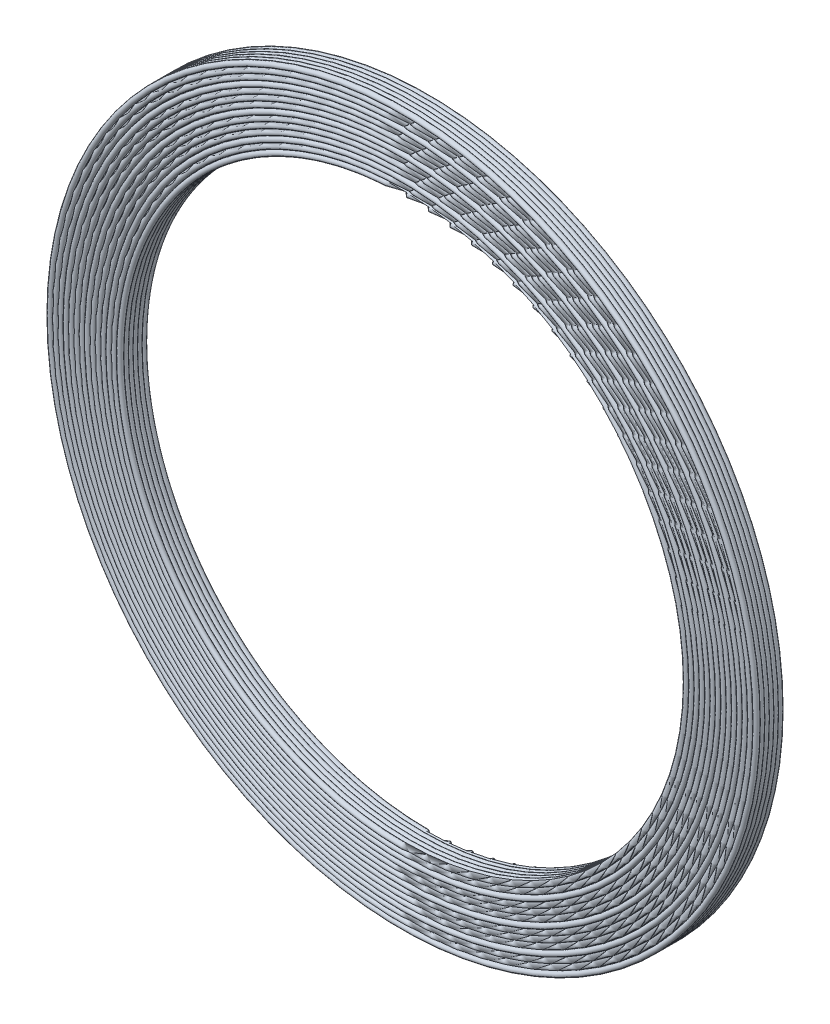
ISO-10303-21;
HEADER;
FILE_DESCRIPTION(('STEP AP214'),'2;1');
FILE_NAME('part.step','',(''),(''),'','','');
FILE_SCHEMA(('AUTOMOTIVE_DESIGN { 1 0 10303 214 1 1 1 1 }'));
ENDSEC;
DATA;
#1=APPLICATION_CONTEXT('core data for automotive mechanical design processes');
#2=APPLICATION_PROTOCOL_DEFINITION('international standard','automotive_design',2000,#1);
#3=PRODUCT_CONTEXT('',#1,'mechanical');
#4=PRODUCT('Part','Part','',(#3));
#5=PRODUCT_RELATED_PRODUCT_CATEGORY('part','',(#4));
#6=PRODUCT_DEFINITION_FORMATION('','',#4);
#7=PRODUCT_DEFINITION_CONTEXT('part definition',#1,'design');
#8=PRODUCT_DEFINITION('design','',#6,#7);
#9=PRODUCT_DEFINITION_SHAPE('','',#8);
#10=(LENGTH_UNIT() NAMED_UNIT(*) SI_UNIT(.MILLI.,.METRE.));
#11=(NAMED_UNIT(*) PLANE_ANGLE_UNIT() SI_UNIT($,.RADIAN.));
#12=(NAMED_UNIT(*) SI_UNIT($,.STERADIAN.) SOLID_ANGLE_UNIT());
#13=UNCERTAINTY_MEASURE_WITH_UNIT(LENGTH_MEASURE(1.E-05),#10,'distance_accuracy_value','');
#14=(GEOMETRIC_REPRESENTATION_CONTEXT(3) GLOBAL_UNCERTAINTY_ASSIGNED_CONTEXT((#13)) GLOBAL_UNIT_ASSIGNED_CONTEXT((#10,
#11,#12)) REPRESENTATION_CONTEXT('',''));
#15=CARTESIAN_POINT('',(0.,0.,0.));
#16=DIRECTION('',(0.,0.,1.));
#17=DIRECTION('',(1.,0.,0.));
#18=AXIS2_PLACEMENT_3D('',#15,#16,#17);
#19=CARTESIAN_POINT('',(0.,0.,1.35714285714286));
#20=DIRECTION('',(0.,0.,1.));
#21=DIRECTION('',(1.,0.,0.));
#22=AXIS2_PLACEMENT_3D('',#19,#20,#21);
#23=TOROIDAL_SURFACE('',#22,18.5714285714286,0.142857142857142);
#24=CARTESIAN_POINT('',(0.,0.,1.35714285714286));
#25=DIRECTION('',(0.,0.,1.));
#26=DIRECTION('',(1.,0.,0.));
#27=AXIS2_PLACEMENT_3D('',#24,#25,#26);
#28=CIRCLE('',#27,18.4285714285714);
#29=CARTESIAN_POINT('',(18.4285714285714,0.,1.35714285714286));
#30=VERTEX_POINT('',#29);
#31=EDGE_CURVE('E10',#30,#30,#28,.T.);
#32=ORIENTED_EDGE('',*,*,#31,.F.);
#33=EDGE_LOOP('',(#32));
#34=FACE_BOUND('',#33,.T.);
#35=CARTESIAN_POINT('',(0.,0.,1.35714285714286));
#36=DIRECTION('',(0.,0.,1.));
#37=DIRECTION('',(1.,0.,0.));
#38=AXIS2_PLACEMENT_3D('',#35,#36,#37);
#39=CIRCLE('',#38,18.7142857142857);
#40=CARTESIAN_POINT('',(18.7142857142857,0.,1.35714285714286));
#41=VERTEX_POINT('',#40);
#42=EDGE_CURVE('E145',#41,#41,#39,.T.);
#43=ORIENTED_EDGE('',*,*,#42,.T.);
#44=EDGE_LOOP('',(#43));
#45=FACE_BOUND('',#44,.T.);
#46=ADVANCED_FACE('F33',(#34,#45),#23,.T.);
#47=CARTESIAN_POINT('',(0.,0.,1.35714285714286));
#48=DIRECTION('',(0.,0.,1.));
#49=DIRECTION('',(1.,0.,0.));
#50=AXIS2_PLACEMENT_3D('',#47,#48,#49);
#51=TOROIDAL_SURFACE('',#50,18.2857142857143,0.142857142857142);
#52=CARTESIAN_POINT('',(0.,0.,1.35714285714286));
#53=DIRECTION('',(0.,0.,1.));
#54=DIRECTION('',(1.,0.,0.));
#55=AXIS2_PLACEMENT_3D('',#52,#53,#54);
#56=CIRCLE('',#55,18.1428571428571);
#57=CARTESIAN_POINT('',(18.1428571428571,0.,1.35714285714286));
#58=VERTEX_POINT('',#57);
#59=EDGE_CURVE('E39',#58,#58,#56,.T.);
#60=ORIENTED_EDGE('',*,*,#59,.F.);
#61=EDGE_LOOP('',(#60));
#62=FACE_BOUND('',#61,.T.);
#63=ORIENTED_EDGE('',*,*,#31,.T.);
#64=EDGE_LOOP('',(#63));
#65=FACE_BOUND('',#64,.T.);
#66=ADVANCED_FACE('F350',(#62,#65),#51,.T.);
#67=CARTESIAN_POINT('',(0.,0.,1.35714285714286));
#68=DIRECTION('',(0.,0.,1.));
#69=DIRECTION('',(1.,0.,0.));
#70=AXIS2_PLACEMENT_3D('',#67,#68,#69);
#71=TOROIDAL_SURFACE('',#70,18.,0.142857142857142);
#72=CARTESIAN_POINT('',(0.,0.,1.35714285714286));
#73=DIRECTION('',(0.,0.,1.));
#74=DIRECTION('',(1.,0.,0.));
#75=AXIS2_PLACEMENT_3D('',#72,#73,#74);
#76=CIRCLE('',#75,17.8571428571429);
#77=CARTESIAN_POINT('',(17.8571428571429,0.,1.35714285714286));
#78=VERTEX_POINT('',#77);
#79=EDGE_CURVE('E43',#78,#78,#76,.T.);
#80=ORIENTED_EDGE('',*,*,#79,.F.);
#81=EDGE_LOOP('',(#80));
#82=FACE_BOUND('',#81,.T.);
#83=ORIENTED_EDGE('',*,*,#59,.T.);
#84=EDGE_LOOP('',(#83));
#85=FACE_BOUND('',#84,.T.);
#86=ADVANCED_FACE('F345',(#82,#85),#71,.T.);
#87=CARTESIAN_POINT('',(0.,0.,1.35714285714286));
#88=DIRECTION('',(0.,0.,1.));
#89=DIRECTION('',(1.,0.,0.));
#90=AXIS2_PLACEMENT_3D('',#87,#88,#89);
#91=TOROIDAL_SURFACE('',#90,17.7142857142857,0.142857142857144);
#92=CARTESIAN_POINT('',(0.,0.,1.35714285714286));
#93=DIRECTION('',(0.,0.,1.));
#94=DIRECTION('',(1.,0.,0.));
#95=AXIS2_PLACEMENT_3D('',#92,#93,#94);
#96=CIRCLE('',#95,17.5714285714286);
#97=CARTESIAN_POINT('',(17.5714285714286,0.,1.35714285714286));
#98=VERTEX_POINT('',#97);
#99=EDGE_CURVE('E47',#98,#98,#96,.T.);
#100=ORIENTED_EDGE('',*,*,#99,.F.);
#101=EDGE_LOOP('',(#100));
#102=FACE_BOUND('',#101,.T.);
#103=ORIENTED_EDGE('',*,*,#79,.T.);
#104=EDGE_LOOP('',(#103));
#105=FACE_BOUND('',#104,.T.);
#106=ADVANCED_FACE('F339',(#102,#105),#91,.T.);
#107=CARTESIAN_POINT('',(0.,0.,1.35714285714286));
#108=DIRECTION('',(0.,0.,1.));
#109=DIRECTION('',(1.,0.,0.));
#110=AXIS2_PLACEMENT_3D('',#107,#108,#109);
#111=TOROIDAL_SURFACE('',#110,17.4285714285714,0.142857142857142);
#112=CARTESIAN_POINT('',(0.,0.,1.35714285714286));
#113=DIRECTION('',(0.,0.,1.));
#114=DIRECTION('',(1.,0.,0.));
#115=AXIS2_PLACEMENT_3D('',#112,#113,#114);
#116=CIRCLE('',#115,17.2857142857143);
#117=CARTESIAN_POINT('',(17.2857142857143,0.,1.35714285714286));
#118=VERTEX_POINT('',#117);
#119=EDGE_CURVE('E52',#118,#118,#116,.T.);
#120=ORIENTED_EDGE('',*,*,#119,.F.);
#121=EDGE_LOOP('',(#120));
#122=FACE_BOUND('',#121,.T.);
#123=ORIENTED_EDGE('',*,*,#99,.T.);
#124=EDGE_LOOP('',(#123));
#125=FACE_BOUND('',#124,.T.);
#126=ADVANCED_FACE('F333',(#122,#125),#111,.T.);
#127=CARTESIAN_POINT('',(0.,0.,1.35714285714286));
#128=DIRECTION('',(0.,0.,1.));
#129=DIRECTION('',(1.,0.,0.));
#130=AXIS2_PLACEMENT_3D('',#127,#128,#129);
#131=TOROIDAL_SURFACE('',#130,17.1428571428571,0.142857142857142);
#132=CARTESIAN_POINT('',(0.,0.,1.35714285714286));
#133=DIRECTION('',(0.,0.,1.));
#134=DIRECTION('',(1.,0.,0.));
#135=AXIS2_PLACEMENT_3D('',#132,#133,#134);
#136=CIRCLE('',#135,17.);
#137=CARTESIAN_POINT('',(17.,0.,1.35714285714286));
#138=VERTEX_POINT('',#137);
#139=EDGE_CURVE('E55',#138,#138,#136,.T.);
#140=ORIENTED_EDGE('',*,*,#139,.F.);
#141=EDGE_LOOP('',(#140));
#142=FACE_BOUND('',#141,.T.);
#143=ORIENTED_EDGE('',*,*,#119,.T.);
#144=EDGE_LOOP('',(#143));
#145=FACE_BOUND('',#144,.T.);
#146=ADVANCED_FACE('F327',(#142,#145),#131,.T.);
#147=CARTESIAN_POINT('',(0.,0.,1.35714285714286));
#148=DIRECTION('',(0.,0.,1.));
#149=DIRECTION('',(1.,0.,0.));
#150=AXIS2_PLACEMENT_3D('',#147,#148,#149);
#151=TOROIDAL_SURFACE('',#150,16.8571428571429,0.142857142857142);
#152=CARTESIAN_POINT('',(0.,0.,1.35714285714286));
#153=DIRECTION('',(0.,0.,1.));
#154=DIRECTION('',(1.,0.,0.));
#155=AXIS2_PLACEMENT_3D('',#152,#153,#154);
#156=CIRCLE('',#155,16.7142857142857);
#157=CARTESIAN_POINT('',(16.7142857142857,0.,1.35714285714286));
#158=VERTEX_POINT('',#157);
#159=EDGE_CURVE('E58',#158,#158,#156,.T.);
#160=ORIENTED_EDGE('',*,*,#159,.F.);
#161=EDGE_LOOP('',(#160));
#162=FACE_BOUND('',#161,.T.);
#163=ORIENTED_EDGE('',*,*,#139,.T.);
#164=EDGE_LOOP('',(#163));
#165=FACE_BOUND('',#164,.T.);
#166=ADVANCED_FACE('F321',(#162,#165),#151,.T.);
#167=CARTESIAN_POINT('',(0.,0.,1.35714285714286));
#168=DIRECTION('',(0.,0.,1.));
#169=DIRECTION('',(1.,0.,0.));
#170=AXIS2_PLACEMENT_3D('',#167,#168,#169);
#171=TOROIDAL_SURFACE('',#170,16.5714285714286,0.142857142857144);
#172=CARTESIAN_POINT('',(0.,0.,1.35714285714286));
#173=DIRECTION('',(0.,0.,1.));
#174=DIRECTION('',(1.,0.,0.));
#175=AXIS2_PLACEMENT_3D('',#172,#173,#174);
#176=CIRCLE('',#175,16.4285714285714);
#177=CARTESIAN_POINT('',(16.4285714285714,0.,1.35714285714286));
#178=VERTEX_POINT('',#177);
#179=EDGE_CURVE('E61',#178,#178,#176,.T.);
#180=ORIENTED_EDGE('',*,*,#179,.F.);
#181=EDGE_LOOP('',(#180));
#182=FACE_BOUND('',#181,.T.);
#183=ORIENTED_EDGE('',*,*,#159,.T.);
#184=EDGE_LOOP('',(#183));
#185=FACE_BOUND('',#184,.T.);
#186=ADVANCED_FACE('F315',(#182,#185),#171,.T.);
#187=CARTESIAN_POINT('',(0.,0.,1.35714285714286));
#188=DIRECTION('',(0.,0.,1.));
#189=DIRECTION('',(1.,0.,0.));
#190=AXIS2_PLACEMENT_3D('',#187,#188,#189);
#191=TOROIDAL_SURFACE('',#190,16.2857142857143,0.142857142857142);
#192=CARTESIAN_POINT('',(0.,0.,1.35714285714286));
#193=DIRECTION('',(0.,0.,1.));
#194=DIRECTION('',(1.,0.,0.));
#195=AXIS2_PLACEMENT_3D('',#192,#193,#194);
#196=CIRCLE('',#195,16.1428571428571);
#197=CARTESIAN_POINT('',(16.1428571428571,0.,1.35714285714286));
#198=VERTEX_POINT('',#197);
#199=EDGE_CURVE('E64',#198,#198,#196,.T.);
#200=ORIENTED_EDGE('',*,*,#199,.F.);
#201=EDGE_LOOP('',(#200));
#202=FACE_BOUND('',#201,.T.);
#203=ORIENTED_EDGE('',*,*,#179,.T.);
#204=EDGE_LOOP('',(#203));
#205=FACE_BOUND('',#204,.T.);
#206=ADVANCED_FACE('F309',(#202,#205),#191,.T.);
#207=CARTESIAN_POINT('',(0.,0.,1.35714285714286));
#208=DIRECTION('',(0.,0.,1.));
#209=DIRECTION('',(1.,0.,0.));
#210=AXIS2_PLACEMENT_3D('',#207,#208,#209);
#211=TOROIDAL_SURFACE('',#210,16.,0.142857142857142);
#212=CARTESIAN_POINT('',(0.,0.,1.35714285714286));
#213=DIRECTION('',(0.,0.,1.));
#214=DIRECTION('',(1.,0.,0.));
#215=AXIS2_PLACEMENT_3D('',#212,#213,#214);
#216=CIRCLE('',#215,15.8571428571429);
#217=CARTESIAN_POINT('',(15.8571428571429,0.,1.35714285714286));
#218=VERTEX_POINT('',#217);
#219=EDGE_CURVE('E67',#218,#218,#216,.T.);
#220=ORIENTED_EDGE('',*,*,#219,.F.);
#221=EDGE_LOOP('',(#220));
#222=FACE_BOUND('',#221,.T.);
#223=ORIENTED_EDGE('',*,*,#199,.T.);
#224=EDGE_LOOP('',(#223));
#225=FACE_BOUND('',#224,.T.);
#226=ADVANCED_FACE('F303',(#222,#225),#211,.T.);
#227=CARTESIAN_POINT('',(0.,0.,1.35714285714286));
#228=DIRECTION('',(0.,0.,1.));
#229=DIRECTION('',(1.,0.,0.));
#230=AXIS2_PLACEMENT_3D('',#227,#228,#229);
#231=TOROIDAL_SURFACE('',#230,15.7142857142857,0.142857142857142);
#232=CARTESIAN_POINT('',(0.,0.,1.35714285714286));
#233=DIRECTION('',(0.,0.,1.));
#234=DIRECTION('',(1.,0.,0.));
#235=AXIS2_PLACEMENT_3D('',#232,#233,#234);
#236=CIRCLE('',#235,15.5714285714286);
#237=CARTESIAN_POINT('',(15.5714285714286,0.,1.35714285714286));
#238=VERTEX_POINT('',#237);
#239=EDGE_CURVE('E70',#238,#238,#236,.T.);
#240=ORIENTED_EDGE('',*,*,#239,.F.);
#241=EDGE_LOOP('',(#240));
#242=FACE_BOUND('',#241,.T.);
#243=ORIENTED_EDGE('',*,*,#219,.T.);
#244=EDGE_LOOP('',(#243));
#245=FACE_BOUND('',#244,.T.);
#246=ADVANCED_FACE('F297',(#242,#245),#231,.T.);
#247=CARTESIAN_POINT('',(0.,0.,1.35714285714286));
#248=DIRECTION('',(0.,0.,1.));
#249=DIRECTION('',(1.,0.,0.));
#250=AXIS2_PLACEMENT_3D('',#247,#248,#249);
#251=TOROIDAL_SURFACE('',#250,15.4285714285714,0.142857142857143);
#252=CARTESIAN_POINT('',(0.,0.,1.35714285714286));
#253=DIRECTION('',(0.,0.,1.));
#254=DIRECTION('',(1.,0.,0.));
#255=AXIS2_PLACEMENT_3D('',#252,#253,#254);
#256=CIRCLE('',#255,15.2857142857143);
#257=CARTESIAN_POINT('',(15.2857142857143,0.,1.35714285714286));
#258=VERTEX_POINT('',#257);
#259=EDGE_CURVE('E73',#258,#258,#256,.T.);
#260=ORIENTED_EDGE('',*,*,#259,.F.);
#261=EDGE_LOOP('',(#260));
#262=FACE_BOUND('',#261,.T.);
#263=ORIENTED_EDGE('',*,*,#239,.T.);
#264=EDGE_LOOP('',(#263));
#265=FACE_BOUND('',#264,.T.);
#266=ADVANCED_FACE('F291',(#262,#265),#251,.T.);
#267=CARTESIAN_POINT('',(0.,0.,1.35714285714286));
#268=DIRECTION('',(0.,0.,1.));
#269=DIRECTION('',(1.,0.,0.));
#270=AXIS2_PLACEMENT_3D('',#267,#268,#269);
#271=TOROIDAL_SURFACE('',#270,15.1428571428571,0.142857142857142);
#272=CARTESIAN_POINT('',(0.,0.,1.23571428571429));
#273=DIRECTION('',(0.,0.,1.));
#274=DIRECTION('',(1.,0.,0.));
#275=AXIS2_PLACEMENT_3D('',#272,#273,#274);
#276=CIRCLE('',#275,15.0676024731939);
#277=CARTESIAN_POINT('',(15.0676024731939,0.,1.23571428571429));
#278=VERTEX_POINT('',#277);
#279=EDGE_CURVE('E76',#278,#278,#276,.T.);
#280=ORIENTED_EDGE('',*,*,#279,.F.);
#281=EDGE_LOOP('',(#280));
#282=FACE_BOUND('',#281,.T.);
#283=ORIENTED_EDGE('',*,*,#259,.T.);
#284=EDGE_LOOP('',(#283));
#285=FACE_BOUND('',#284,.T.);
#286=ADVANCED_FACE('F285',(#282,#285),#271,.T.);
#287=CARTESIAN_POINT('',(0.,0.,1.11428571428571));
#288=DIRECTION('',(0.,0.,1.));
#289=DIRECTION('',(1.,0.,0.));
#290=AXIS2_PLACEMENT_3D('',#287,#288,#289);
#291=TOROIDAL_SURFACE('',#290,15.1428571428571,0.142857142857142);
#292=CARTESIAN_POINT('',(0.,0.,0.992857142857142));
#293=DIRECTION('',(0.,0.,1.));
#294=DIRECTION('',(1.,0.,0.));
#295=AXIS2_PLACEMENT_3D('',#292,#293,#294);
#296=CIRCLE('',#295,15.0676024731939);
#297=CARTESIAN_POINT('',(15.0676024731939,0.,0.992857142857142));
#298=VERTEX_POINT('',#297);
#299=EDGE_CURVE('E79',#298,#298,#296,.T.);
#300=ORIENTED_EDGE('',*,*,#299,.F.);
#301=EDGE_LOOP('',(#300));
#302=FACE_BOUND('',#301,.T.);
#303=ORIENTED_EDGE('',*,*,#279,.T.);
#304=EDGE_LOOP('',(#303));
#305=FACE_BOUND('',#304,.T.);
#306=ADVANCED_FACE('F279',(#302,#305),#291,.T.);
#307=CARTESIAN_POINT('',(0.,0.,0.871428571428571));
#308=DIRECTION('',(0.,0.,1.));
#309=DIRECTION('',(1.,0.,0.));
#310=AXIS2_PLACEMENT_3D('',#307,#308,#309);
#311=TOROIDAL_SURFACE('',#310,15.1428571428571,0.142857142857142);
#312=CARTESIAN_POINT('',(0.,0.,0.750000000000001));
#313=DIRECTION('',(0.,0.,1.));
#314=DIRECTION('',(1.,0.,0.));
#315=AXIS2_PLACEMENT_3D('',#312,#313,#314);
#316=CIRCLE('',#315,15.0676024731939);
#317=CARTESIAN_POINT('',(15.0676024731939,0.,0.750000000000001));
#318=VERTEX_POINT('',#317);
#319=EDGE_CURVE('E82',#318,#318,#316,.T.);
#320=ORIENTED_EDGE('',*,*,#319,.F.);
#321=EDGE_LOOP('',(#320));
#322=FACE_BOUND('',#321,.T.);
#323=ORIENTED_EDGE('',*,*,#299,.T.);
#324=EDGE_LOOP('',(#323));
#325=FACE_BOUND('',#324,.T.);
#326=ADVANCED_FACE('F273',(#322,#325),#311,.T.);
#327=CARTESIAN_POINT('',(0.,0.,0.62857142857143));
#328=DIRECTION('',(0.,0.,1.));
#329=DIRECTION('',(1.,0.,0.));
#330=AXIS2_PLACEMENT_3D('',#327,#328,#329);
#331=TOROIDAL_SURFACE('',#330,15.1428571428571,0.142857142857142);
#332=CARTESIAN_POINT('',(0.,0.,0.507142857142859));
#333=DIRECTION('',(0.,0.,1.));
#334=DIRECTION('',(1.,0.,0.));
#335=AXIS2_PLACEMENT_3D('',#332,#333,#334);
#336=CIRCLE('',#335,15.0676024731939);
#337=CARTESIAN_POINT('',(15.0676024731939,0.,0.507142857142859));
#338=VERTEX_POINT('',#337);
#339=EDGE_CURVE('E85',#338,#338,#336,.T.);
#340=ORIENTED_EDGE('',*,*,#339,.F.);
#341=EDGE_LOOP('',(#340));
#342=FACE_BOUND('',#341,.T.);
#343=ORIENTED_EDGE('',*,*,#319,.T.);
#344=EDGE_LOOP('',(#343));
#345=FACE_BOUND('',#344,.T.);
#346=ADVANCED_FACE('F267',(#342,#345),#331,.T.);
#347=CARTESIAN_POINT('',(0.,0.,0.385714285714287));
#348=DIRECTION('',(0.,0.,1.));
#349=DIRECTION('',(1.,0.,0.));
#350=AXIS2_PLACEMENT_3D('',#347,#348,#349);
#351=TOROIDAL_SURFACE('',#350,15.1428571428571,0.142857142857142);
#352=CARTESIAN_POINT('',(0.,0.,0.264285714285716));
#353=DIRECTION('',(0.,0.,1.));
#354=DIRECTION('',(1.,0.,0.));
#355=AXIS2_PLACEMENT_3D('',#352,#353,#354);
#356=CIRCLE('',#355,15.0676024731939);
#357=CARTESIAN_POINT('',(15.0676024731939,0.,0.264285714285716));
#358=VERTEX_POINT('',#357);
#359=EDGE_CURVE('E88',#358,#358,#356,.T.);
#360=ORIENTED_EDGE('',*,*,#359,.F.);
#361=EDGE_LOOP('',(#360));
#362=FACE_BOUND('',#361,.T.);
#363=ORIENTED_EDGE('',*,*,#339,.T.);
#364=EDGE_LOOP('',(#363));
#365=FACE_BOUND('',#364,.T.);
#366=ADVANCED_FACE('F261',(#362,#365),#351,.T.);
#367=CARTESIAN_POINT('',(0.,0.,0.142857142857144));
#368=DIRECTION('',(0.,0.,1.));
#369=DIRECTION('',(1.,0.,0.));
#370=AXIS2_PLACEMENT_3D('',#367,#368,#369);
#371=TOROIDAL_SURFACE('',#370,15.1428571428571,0.142857142857142);
#372=CARTESIAN_POINT('',(0.,0.,0.142857142857144));
#373=DIRECTION('',(0.,0.,1.));
#374=DIRECTION('',(1.,0.,0.));
#375=AXIS2_PLACEMENT_3D('',#372,#373,#374);
#376=CIRCLE('',#375,15.2857142857143);
#377=CARTESIAN_POINT('',(15.2857142857143,0.,0.142857142857144));
#378=VERTEX_POINT('',#377);
#379=EDGE_CURVE('E91',#378,#378,#376,.T.);
#380=ORIENTED_EDGE('',*,*,#379,.F.);
#381=EDGE_LOOP('',(#380));
#382=FACE_BOUND('',#381,.T.);
#383=ORIENTED_EDGE('',*,*,#359,.T.);
#384=EDGE_LOOP('',(#383));
#385=FACE_BOUND('',#384,.T.);
#386=ADVANCED_FACE('F255',(#382,#385),#371,.T.);
#387=CARTESIAN_POINT('',(0.,0.,0.142857142857144));
#388=DIRECTION('',(0.,0.,1.));
#389=DIRECTION('',(1.,0.,0.));
#390=AXIS2_PLACEMENT_3D('',#387,#388,#389);
#391=TOROIDAL_SURFACE('',#390,15.4285714285714,0.142857142857143);
#392=CARTESIAN_POINT('',(0.,0.,0.142857142857144));
#393=DIRECTION('',(0.,0.,1.));
#394=DIRECTION('',(1.,0.,0.));
#395=AXIS2_PLACEMENT_3D('',#392,#393,#394);
#396=CIRCLE('',#395,15.5714285714286);
#397=CARTESIAN_POINT('',(15.5714285714286,0.,0.142857142857144));
#398=VERTEX_POINT('',#397);
#399=EDGE_CURVE('E94',#398,#398,#396,.T.);
#400=ORIENTED_EDGE('',*,*,#399,.F.);
#401=EDGE_LOOP('',(#400));
#402=FACE_BOUND('',#401,.T.);
#403=ORIENTED_EDGE('',*,*,#379,.T.);
#404=EDGE_LOOP('',(#403));
#405=FACE_BOUND('',#404,.T.);
#406=ADVANCED_FACE('F249',(#402,#405),#391,.T.);
#407=CARTESIAN_POINT('',(0.,0.,0.142857142857144));
#408=DIRECTION('',(0.,0.,1.));
#409=DIRECTION('',(1.,0.,0.));
#410=AXIS2_PLACEMENT_3D('',#407,#408,#409);
#411=TOROIDAL_SURFACE('',#410,15.7142857142857,0.142857142857142);
#412=CARTESIAN_POINT('',(0.,0.,0.142857142857144));
#413=DIRECTION('',(0.,0.,1.));
#414=DIRECTION('',(1.,0.,0.));
#415=AXIS2_PLACEMENT_3D('',#412,#413,#414);
#416=CIRCLE('',#415,15.8571428571429);
#417=CARTESIAN_POINT('',(15.8571428571429,0.,0.142857142857144));
#418=VERTEX_POINT('',#417);
#419=EDGE_CURVE('E97',#418,#418,#416,.T.);
#420=ORIENTED_EDGE('',*,*,#419,.F.);
#421=EDGE_LOOP('',(#420));
#422=FACE_BOUND('',#421,.T.);
#423=ORIENTED_EDGE('',*,*,#399,.T.);
#424=EDGE_LOOP('',(#423));
#425=FACE_BOUND('',#424,.T.);
#426=ADVANCED_FACE('F243',(#422,#425),#411,.T.);
#427=CARTESIAN_POINT('',(0.,0.,0.142857142857144));
#428=DIRECTION('',(0.,0.,1.));
#429=DIRECTION('',(1.,0.,0.));
#430=AXIS2_PLACEMENT_3D('',#427,#428,#429);
#431=TOROIDAL_SURFACE('',#430,16.,0.142857142857142);
#432=CARTESIAN_POINT('',(0.,0.,0.142857142857144));
#433=DIRECTION('',(0.,0.,1.));
#434=DIRECTION('',(1.,0.,0.));
#435=AXIS2_PLACEMENT_3D('',#432,#433,#434);
#436=CIRCLE('',#435,16.1428571428571);
#437=CARTESIAN_POINT('',(16.1428571428571,0.,0.142857142857144));
#438=VERTEX_POINT('',#437);
#439=EDGE_CURVE('E100',#438,#438,#436,.T.);
#440=ORIENTED_EDGE('',*,*,#439,.F.);
#441=EDGE_LOOP('',(#440));
#442=FACE_BOUND('',#441,.T.);
#443=ORIENTED_EDGE('',*,*,#419,.T.);
#444=EDGE_LOOP('',(#443));
#445=FACE_BOUND('',#444,.T.);
#446=ADVANCED_FACE('F237',(#442,#445),#431,.T.);
#447=CARTESIAN_POINT('',(0.,0.,0.142857142857144));
#448=DIRECTION('',(0.,0.,1.));
#449=DIRECTION('',(1.,0.,0.));
#450=AXIS2_PLACEMENT_3D('',#447,#448,#449);
#451=TOROIDAL_SURFACE('',#450,16.2857142857143,0.142857142857142);
#452=CARTESIAN_POINT('',(0.,0.,0.142857142857144));
#453=DIRECTION('',(0.,0.,1.));
#454=DIRECTION('',(1.,0.,0.));
#455=AXIS2_PLACEMENT_3D('',#452,#453,#454);
#456=CIRCLE('',#455,16.4285714285714);
#457=CARTESIAN_POINT('',(16.4285714285714,0.,0.142857142857144));
#458=VERTEX_POINT('',#457);
#459=EDGE_CURVE('E103',#458,#458,#456,.T.);
#460=ORIENTED_EDGE('',*,*,#459,.F.);
#461=EDGE_LOOP('',(#460));
#462=FACE_BOUND('',#461,.T.);
#463=ORIENTED_EDGE('',*,*,#439,.T.);
#464=EDGE_LOOP('',(#463));
#465=FACE_BOUND('',#464,.T.);
#466=ADVANCED_FACE('F231',(#462,#465),#451,.T.);
#467=CARTESIAN_POINT('',(0.,0.,0.142857142857144));
#468=DIRECTION('',(0.,0.,1.));
#469=DIRECTION('',(1.,0.,0.));
#470=AXIS2_PLACEMENT_3D('',#467,#468,#469);
#471=TOROIDAL_SURFACE('',#470,16.5714285714286,0.142857142857144);
#472=CARTESIAN_POINT('',(0.,0.,0.142857142857144));
#473=DIRECTION('',(0.,0.,1.));
#474=DIRECTION('',(1.,0.,0.));
#475=AXIS2_PLACEMENT_3D('',#472,#473,#474);
#476=CIRCLE('',#475,16.7142857142857);
#477=CARTESIAN_POINT('',(16.7142857142857,0.,0.142857142857144));
#478=VERTEX_POINT('',#477);
#479=EDGE_CURVE('E106',#478,#478,#476,.T.);
#480=ORIENTED_EDGE('',*,*,#479,.F.);
#481=EDGE_LOOP('',(#480));
#482=FACE_BOUND('',#481,.T.);
#483=ORIENTED_EDGE('',*,*,#459,.T.);
#484=EDGE_LOOP('',(#483));
#485=FACE_BOUND('',#484,.T.);
#486=ADVANCED_FACE('F225',(#482,#485),#471,.T.);
#487=CARTESIAN_POINT('',(0.,0.,0.142857142857144));
#488=DIRECTION('',(0.,0.,1.));
#489=DIRECTION('',(1.,0.,0.));
#490=AXIS2_PLACEMENT_3D('',#487,#488,#489);
#491=TOROIDAL_SURFACE('',#490,16.8571428571429,0.142857142857142);
#492=CARTESIAN_POINT('',(0.,0.,0.142857142857144));
#493=DIRECTION('',(0.,0.,1.));
#494=DIRECTION('',(1.,0.,0.));
#495=AXIS2_PLACEMENT_3D('',#492,#493,#494);
#496=CIRCLE('',#495,17.);
#497=CARTESIAN_POINT('',(17.,0.,0.142857142857144));
#498=VERTEX_POINT('',#497);
#499=EDGE_CURVE('E109',#498,#498,#496,.T.);
#500=ORIENTED_EDGE('',*,*,#499,.F.);
#501=EDGE_LOOP('',(#500));
#502=FACE_BOUND('',#501,.T.);
#503=ORIENTED_EDGE('',*,*,#479,.T.);
#504=EDGE_LOOP('',(#503));
#505=FACE_BOUND('',#504,.T.);
#506=ADVANCED_FACE('F219',(#502,#505),#491,.T.);
#507=CARTESIAN_POINT('',(0.,0.,0.142857142857144));
#508=DIRECTION('',(0.,0.,1.));
#509=DIRECTION('',(1.,0.,0.));
#510=AXIS2_PLACEMENT_3D('',#507,#508,#509);
#511=TOROIDAL_SURFACE('',#510,17.1428571428571,0.142857142857142);
#512=CARTESIAN_POINT('',(0.,0.,0.142857142857144));
#513=DIRECTION('',(0.,0.,1.));
#514=DIRECTION('',(1.,0.,0.));
#515=AXIS2_PLACEMENT_3D('',#512,#513,#514);
#516=CIRCLE('',#515,17.2857142857143);
#517=CARTESIAN_POINT('',(17.2857142857143,0.,0.142857142857144));
#518=VERTEX_POINT('',#517);
#519=EDGE_CURVE('E112',#518,#518,#516,.T.);
#520=ORIENTED_EDGE('',*,*,#519,.F.);
#521=EDGE_LOOP('',(#520));
#522=FACE_BOUND('',#521,.T.);
#523=ORIENTED_EDGE('',*,*,#499,.T.);
#524=EDGE_LOOP('',(#523));
#525=FACE_BOUND('',#524,.T.);
#526=ADVANCED_FACE('F213',(#522,#525),#511,.T.);
#527=CARTESIAN_POINT('',(0.,0.,0.142857142857144));
#528=DIRECTION('',(0.,0.,1.));
#529=DIRECTION('',(1.,0.,0.));
#530=AXIS2_PLACEMENT_3D('',#527,#528,#529);
#531=TOROIDAL_SURFACE('',#530,17.4285714285714,0.142857142857142);
#532=CARTESIAN_POINT('',(0.,0.,0.142857142857144));
#533=DIRECTION('',(0.,0.,1.));
#534=DIRECTION('',(1.,0.,0.));
#535=AXIS2_PLACEMENT_3D('',#532,#533,#534);
#536=CIRCLE('',#535,17.5714285714286);
#537=CARTESIAN_POINT('',(17.5714285714286,0.,0.142857142857144));
#538=VERTEX_POINT('',#537);
#539=EDGE_CURVE('E115',#538,#538,#536,.T.);
#540=ORIENTED_EDGE('',*,*,#539,.F.);
#541=EDGE_LOOP('',(#540));
#542=FACE_BOUND('',#541,.T.);
#543=ORIENTED_EDGE('',*,*,#519,.T.);
#544=EDGE_LOOP('',(#543));
#545=FACE_BOUND('',#544,.T.);
#546=ADVANCED_FACE('F207',(#542,#545),#531,.T.);
#547=CARTESIAN_POINT('',(0.,0.,0.142857142857144));
#548=DIRECTION('',(0.,0.,1.));
#549=DIRECTION('',(1.,0.,0.));
#550=AXIS2_PLACEMENT_3D('',#547,#548,#549);
#551=TOROIDAL_SURFACE('',#550,17.7142857142857,0.142857142857144);
#552=CARTESIAN_POINT('',(0.,0.,0.142857142857144));
#553=DIRECTION('',(0.,0.,1.));
#554=DIRECTION('',(1.,0.,0.));
#555=AXIS2_PLACEMENT_3D('',#552,#553,#554);
#556=CIRCLE('',#555,17.8571428571429);
#557=CARTESIAN_POINT('',(17.8571428571429,0.,0.142857142857144));
#558=VERTEX_POINT('',#557);
#559=EDGE_CURVE('E118',#558,#558,#556,.T.);
#560=ORIENTED_EDGE('',*,*,#559,.F.);
#561=EDGE_LOOP('',(#560));
#562=FACE_BOUND('',#561,.T.);
#563=ORIENTED_EDGE('',*,*,#539,.T.);
#564=EDGE_LOOP('',(#563));
#565=FACE_BOUND('',#564,.T.);
#566=ADVANCED_FACE('F201',(#562,#565),#551,.T.);
#567=CARTESIAN_POINT('',(0.,0.,0.142857142857144));
#568=DIRECTION('',(0.,0.,1.));
#569=DIRECTION('',(1.,0.,0.));
#570=AXIS2_PLACEMENT_3D('',#567,#568,#569);
#571=TOROIDAL_SURFACE('',#570,18.,0.142857142857142);
#572=CARTESIAN_POINT('',(0.,0.,0.142857142857144));
#573=DIRECTION('',(0.,0.,1.));
#574=DIRECTION('',(1.,0.,0.));
#575=AXIS2_PLACEMENT_3D('',#572,#573,#574);
#576=CIRCLE('',#575,18.1428571428571);
#577=CARTESIAN_POINT('',(18.1428571428571,0.,0.142857142857144));
#578=VERTEX_POINT('',#577);
#579=EDGE_CURVE('E121',#578,#578,#576,.T.);
#580=ORIENTED_EDGE('',*,*,#579,.F.);
#581=EDGE_LOOP('',(#580));
#582=FACE_BOUND('',#581,.T.);
#583=ORIENTED_EDGE('',*,*,#559,.T.);
#584=EDGE_LOOP('',(#583));
#585=FACE_BOUND('',#584,.T.);
#586=ADVANCED_FACE('F195',(#582,#585),#571,.T.);
#587=CARTESIAN_POINT('',(0.,0.,0.142857142857144));
#588=DIRECTION('',(0.,0.,1.));
#589=DIRECTION('',(1.,0.,0.));
#590=AXIS2_PLACEMENT_3D('',#587,#588,#589);
#591=TOROIDAL_SURFACE('',#590,18.2857142857143,0.142857142857142);
#592=CARTESIAN_POINT('',(0.,0.,0.142857142857144));
#593=DIRECTION('',(0.,0.,1.));
#594=DIRECTION('',(1.,0.,0.));
#595=AXIS2_PLACEMENT_3D('',#592,#593,#594);
#596=CIRCLE('',#595,18.4285714285714);
#597=CARTESIAN_POINT('',(18.4285714285714,0.,0.142857142857144));
#598=VERTEX_POINT('',#597);
#599=EDGE_CURVE('E124',#598,#598,#596,.T.);
#600=ORIENTED_EDGE('',*,*,#599,.F.);
#601=EDGE_LOOP('',(#600));
#602=FACE_BOUND('',#601,.T.);
#603=ORIENTED_EDGE('',*,*,#579,.T.);
#604=EDGE_LOOP('',(#603));
#605=FACE_BOUND('',#604,.T.);
#606=ADVANCED_FACE('F189',(#602,#605),#591,.T.);
#607=CARTESIAN_POINT('',(0.,0.,0.142857142857144));
#608=DIRECTION('',(0.,0.,1.));
#609=DIRECTION('',(1.,0.,0.));
#610=AXIS2_PLACEMENT_3D('',#607,#608,#609);
#611=TOROIDAL_SURFACE('',#610,18.5714285714286,0.142857142857142);
#612=CARTESIAN_POINT('',(0.,0.,0.142857142857144));
#613=DIRECTION('',(0.,0.,1.));
#614=DIRECTION('',(1.,0.,0.));
#615=AXIS2_PLACEMENT_3D('',#612,#613,#614);
#616=CIRCLE('',#615,18.7142857142857);
#617=CARTESIAN_POINT('',(18.7142857142857,0.,0.142857142857144));
#618=VERTEX_POINT('',#617);
#619=EDGE_CURVE('E127',#618,#618,#616,.T.);
#620=ORIENTED_EDGE('',*,*,#619,.F.);
#621=EDGE_LOOP('',(#620));
#622=FACE_BOUND('',#621,.T.);
#623=ORIENTED_EDGE('',*,*,#599,.T.);
#624=EDGE_LOOP('',(#623));
#625=FACE_BOUND('',#624,.T.);
#626=ADVANCED_FACE('F183',(#622,#625),#611,.T.);
#627=CARTESIAN_POINT('',(0.,0.,0.142857142857144));
#628=DIRECTION('',(0.,0.,1.));
#629=DIRECTION('',(1.,0.,0.));
#630=AXIS2_PLACEMENT_3D('',#627,#628,#629);
#631=TOROIDAL_SURFACE('',#630,18.8571428571429,0.142857142857143);
#632=CARTESIAN_POINT('',(0.,0.,0.264285714285716));
#633=DIRECTION('',(0.,0.,1.));
#634=DIRECTION('',(1.,0.,0.));
#635=AXIS2_PLACEMENT_3D('',#632,#633,#634);
#636=CIRCLE('',#635,18.9323975268061);
#637=CARTESIAN_POINT('',(18.9323975268061,0.,0.264285714285716));
#638=VERTEX_POINT('',#637);
#639=EDGE_CURVE('E130',#638,#638,#636,.T.);
#640=ORIENTED_EDGE('',*,*,#639,.F.);
#641=EDGE_LOOP('',(#640));
#642=FACE_BOUND('',#641,.T.);
#643=ORIENTED_EDGE('',*,*,#619,.T.);
#644=EDGE_LOOP('',(#643));
#645=FACE_BOUND('',#644,.T.);
#646=ADVANCED_FACE('F177',(#642,#645),#631,.T.);
#647=CARTESIAN_POINT('',(0.,0.,0.385714285714287));
#648=DIRECTION('',(0.,0.,1.));
#649=DIRECTION('',(1.,0.,0.));
#650=AXIS2_PLACEMENT_3D('',#647,#648,#649);
#651=TOROIDAL_SURFACE('',#650,18.8571428571429,0.142857142857143);
#652=CARTESIAN_POINT('',(0.,0.,0.50714285714286));
#653=DIRECTION('',(0.,0.,1.));
#654=DIRECTION('',(1.,0.,0.));
#655=AXIS2_PLACEMENT_3D('',#652,#653,#654);
#656=CIRCLE('',#655,18.9323975268061);
#657=CARTESIAN_POINT('',(18.9323975268061,0.,0.50714285714286));
#658=VERTEX_POINT('',#657);
#659=EDGE_CURVE('E133',#658,#658,#656,.T.);
#660=ORIENTED_EDGE('',*,*,#659,.F.);
#661=EDGE_LOOP('',(#660));
#662=FACE_BOUND('',#661,.T.);
#663=ORIENTED_EDGE('',*,*,#639,.T.);
#664=EDGE_LOOP('',(#663));
#665=FACE_BOUND('',#664,.T.);
#666=ADVANCED_FACE('F171',(#662,#665),#651,.T.);
#667=CARTESIAN_POINT('',(0.,0.,0.62857142857143));
#668=DIRECTION('',(0.,0.,1.));
#669=DIRECTION('',(1.,0.,0.));
#670=AXIS2_PLACEMENT_3D('',#667,#668,#669);
#671=TOROIDAL_SURFACE('',#670,18.8571428571429,0.142857142857142);
#672=CARTESIAN_POINT('',(0.,0.,0.749999999999999));
#673=DIRECTION('',(0.,0.,1.));
#674=DIRECTION('',(1.,0.,0.));
#675=AXIS2_PLACEMENT_3D('',#672,#673,#674);
#676=CIRCLE('',#675,18.9323975268061);
#677=CARTESIAN_POINT('',(18.9323975268061,0.,0.749999999999999));
#678=VERTEX_POINT('',#677);
#679=EDGE_CURVE('E136',#678,#678,#676,.T.);
#680=ORIENTED_EDGE('',*,*,#679,.F.);
#681=EDGE_LOOP('',(#680));
#682=FACE_BOUND('',#681,.T.);
#683=ORIENTED_EDGE('',*,*,#659,.T.);
#684=EDGE_LOOP('',(#683));
#685=FACE_BOUND('',#684,.T.);
#686=ADVANCED_FACE('F165',(#682,#685),#671,.T.);
#687=CARTESIAN_POINT('',(0.,0.,0.871428571428571));
#688=DIRECTION('',(0.,0.,1.));
#689=DIRECTION('',(1.,0.,0.));
#690=AXIS2_PLACEMENT_3D('',#687,#688,#689);
#691=TOROIDAL_SURFACE('',#690,18.8571428571429,0.142857142857143);
#692=CARTESIAN_POINT('',(0.,0.,0.992857142857143));
#693=DIRECTION('',(0.,0.,1.));
#694=DIRECTION('',(1.,0.,0.));
#695=AXIS2_PLACEMENT_3D('',#692,#693,#694);
#696=CIRCLE('',#695,18.9323975268061);
#697=CARTESIAN_POINT('',(18.9323975268061,0.,0.992857142857143));
#698=VERTEX_POINT('',#697);
#699=EDGE_CURVE('E139',#698,#698,#696,.T.);
#700=ORIENTED_EDGE('',*,*,#699,.F.);
#701=EDGE_LOOP('',(#700));
#702=FACE_BOUND('',#701,.T.);
#703=ORIENTED_EDGE('',*,*,#679,.T.);
#704=EDGE_LOOP('',(#703));
#705=FACE_BOUND('',#704,.T.);
#706=ADVANCED_FACE('F159',(#702,#705),#691,.T.);
#707=CARTESIAN_POINT('',(0.,0.,1.11428571428571));
#708=DIRECTION('',(0.,0.,1.));
#709=DIRECTION('',(1.,0.,0.));
#710=AXIS2_PLACEMENT_3D('',#707,#708,#709);
#711=TOROIDAL_SURFACE('',#710,18.8571428571429,0.142857142857143);
#712=CARTESIAN_POINT('',(0.,0.,1.23571428571429));
#713=DIRECTION('',(0.,0.,1.));
#714=DIRECTION('',(1.,0.,0.));
#715=AXIS2_PLACEMENT_3D('',#712,#713,#714);
#716=CIRCLE('',#715,18.9323975268061);
#717=CARTESIAN_POINT('',(18.9323975268061,0.,1.23571428571429));
#718=VERTEX_POINT('',#717);
#719=EDGE_CURVE('E142',#718,#718,#716,.T.);
#720=ORIENTED_EDGE('',*,*,#719,.F.);
#721=EDGE_LOOP('',(#720));
#722=FACE_BOUND('',#721,.T.);
#723=ORIENTED_EDGE('',*,*,#699,.T.);
#724=EDGE_LOOP('',(#723));
#725=FACE_BOUND('',#724,.T.);
#726=ADVANCED_FACE('F153',(#722,#725),#711,.T.);
#727=CARTESIAN_POINT('',(0.,0.,1.35714285714286));
#728=DIRECTION('',(0.,0.,1.));
#729=DIRECTION('',(1.,0.,0.));
#730=AXIS2_PLACEMENT_3D('',#727,#728,#729);
#731=TOROIDAL_SURFACE('',#730,18.8571428571429,0.142857142857143);
#732=ORIENTED_EDGE('',*,*,#42,.F.);
#733=EDGE_LOOP('',(#732));
#734=FACE_BOUND('',#733,.T.);
#735=ORIENTED_EDGE('',*,*,#719,.T.);
#736=EDGE_LOOP('',(#735));
#737=FACE_BOUND('',#736,.T.);
#738=ADVANCED_FACE('F150',(#734,#737),#731,.T.);
#739=CLOSED_SHELL('',(#46,#66,#86,#106,#126,#146,#166,#186,#206,#226,#246,#266,#286,#306,#326,
#346,#366,#386,#406,#426,#446,#466,#486,#506,#526,#546,#566,#586,#606,#626,#646,#666,#686,#706,
#726,#738));
#740=MANIFOLD_SOLID_BREP('B2',#739);
#741=ADVANCED_BREP_SHAPE_REPRESENTATION('',(#18,#740),#14);
#742=SHAPE_DEFINITION_REPRESENTATION(#9,#741);
ENDSEC;
END-ISO-10303-21;
